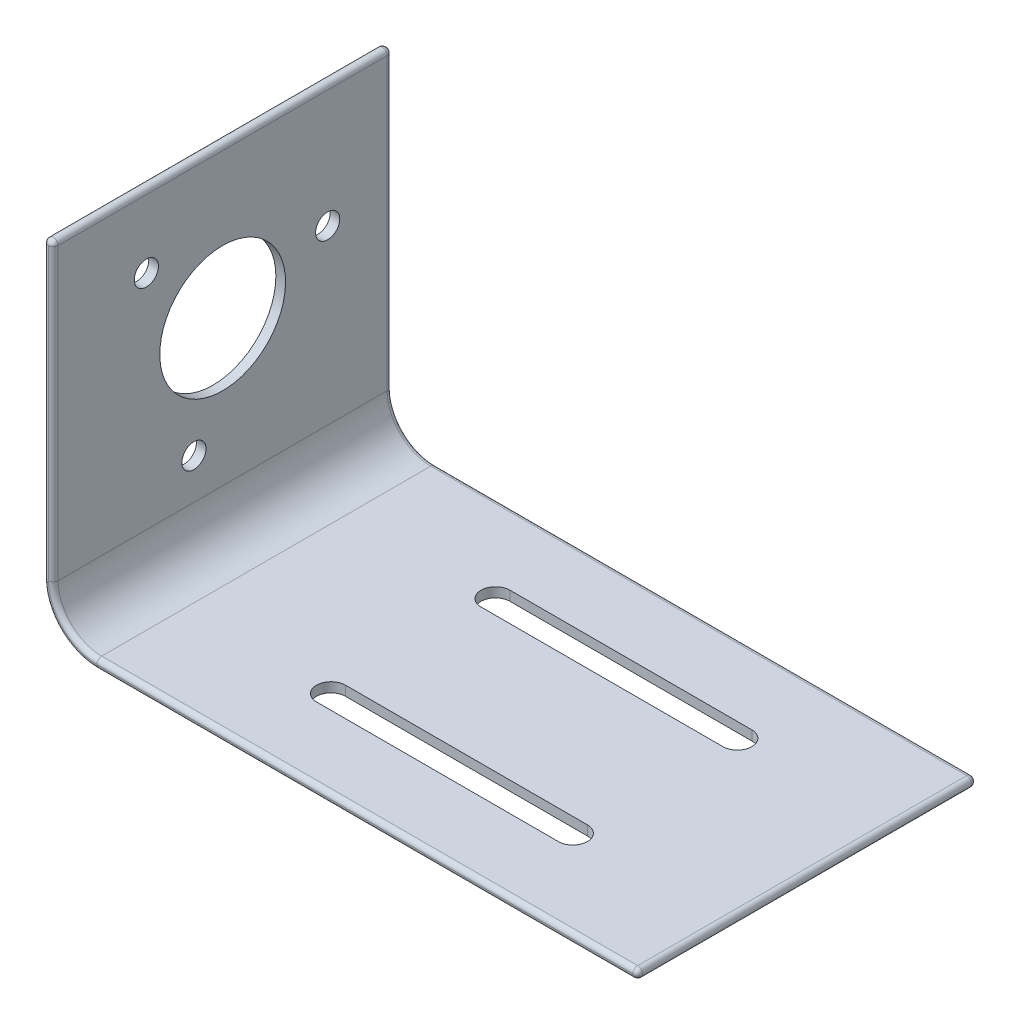
ISO-10303-21;
HEADER;
FILE_DESCRIPTION(('STEP AP214'),'2;1');
FILE_NAME('part.step','',(''),(''),'','','');
FILE_SCHEMA(('AUTOMOTIVE_DESIGN { 1 0 10303 214 1 1 1 1 }'));
ENDSEC;
DATA;
#1=APPLICATION_CONTEXT('core data for automotive mechanical design processes');
#2=APPLICATION_PROTOCOL_DEFINITION('international standard','automotive_design',2000,#1);
#3=PRODUCT_CONTEXT('',#1,'mechanical');
#4=PRODUCT('Part','Part','',(#3));
#5=PRODUCT_RELATED_PRODUCT_CATEGORY('part','',(#4));
#6=PRODUCT_DEFINITION_FORMATION('','',#4);
#7=PRODUCT_DEFINITION_CONTEXT('part definition',#1,'design');
#8=PRODUCT_DEFINITION('design','',#6,#7);
#9=PRODUCT_DEFINITION_SHAPE('','',#8);
#10=(LENGTH_UNIT() NAMED_UNIT(*) SI_UNIT(.MILLI.,.METRE.));
#11=(NAMED_UNIT(*) PLANE_ANGLE_UNIT() SI_UNIT($,.RADIAN.));
#12=(NAMED_UNIT(*) SI_UNIT($,.STERADIAN.) SOLID_ANGLE_UNIT());
#13=UNCERTAINTY_MEASURE_WITH_UNIT(LENGTH_MEASURE(1.E-05),#10,'distance_accuracy_value','');
#14=(GEOMETRIC_REPRESENTATION_CONTEXT(3) GLOBAL_UNCERTAINTY_ASSIGNED_CONTEXT((#13)) GLOBAL_UNIT_ASSIGNED_CONTEXT((#10,
#11,#12)) REPRESENTATION_CONTEXT('',''));
#15=CARTESIAN_POINT('',(0.,0.,0.));
#16=DIRECTION('',(0.,0.,1.));
#17=DIRECTION('',(1.,0.,0.));
#18=AXIS2_PLACEMENT_3D('',#15,#16,#17);
#19=CARTESIAN_POINT('',(0.,-0.5,35.));
#20=DIRECTION('',(0.,-1.,0.));
#21=DIRECTION('',(1.,0.,0.));
#22=AXIS2_PLACEMENT_3D('',#19,#20,#21);
#23=PLANE('',#22);
#24=CARTESIAN_POINT('',(-40.2,-0.500000000000007,9.00000000000001));
#25=DIRECTION('',(0.,-1.,0.));
#26=DIRECTION('',(1.,0.,0.));
#27=AXIS2_PLACEMENT_3D('',#24,#25,#26);
#28=CIRCLE('',#27,1.5);
#29=CARTESIAN_POINT('',(-40.2,-0.5,10.5));
#30=VERTEX_POINT('',#29);
#31=CARTESIAN_POINT('',(-40.2,-0.5,7.50000000000001));
#32=VERTEX_POINT('',#31);
#33=EDGE_CURVE('E242',#30,#32,#28,.T.);
#34=ORIENTED_EDGE('',*,*,#33,.F.);
#35=DIRECTION('',(-1.,0.,0.));
#36=VECTOR('',#35,1.);
#37=CARTESIAN_POINT('',(0.,-0.5,10.5));
#38=LINE('',#37,#36);
#39=CARTESIAN_POINT('',(-15.2,-0.500000000000002,10.5));
#40=VERTEX_POINT('',#39);
#41=EDGE_CURVE('E236',#40,#30,#38,.T.);
#42=ORIENTED_EDGE('',*,*,#41,.F.);
#43=CARTESIAN_POINT('',(-15.2,-0.5,9.));
#44=DIRECTION('',(0.,-1.,0.));
#45=DIRECTION('',(1.,0.,0.));
#46=AXIS2_PLACEMENT_3D('',#43,#44,#45);
#47=CIRCLE('',#46,1.5);
#48=CARTESIAN_POINT('',(-15.2,-0.5,7.5));
#49=VERTEX_POINT('',#48);
#50=EDGE_CURVE('E179',#49,#40,#47,.T.);
#51=ORIENTED_EDGE('',*,*,#50,.F.);
#52=DIRECTION('',(-1.,0.,0.));
#53=VECTOR('',#52,1.);
#54=CARTESIAN_POINT('',(0.,-0.5,7.5));
#55=LINE('',#54,#53);
#56=EDGE_CURVE('E239',#49,#32,#55,.T.);
#57=ORIENTED_EDGE('',*,*,#56,.T.);
#58=EDGE_LOOP('',(#34,#42,#51,#57));
#59=FACE_BOUND('',#58,.T.);
#60=DIRECTION('',(0.,0.,-1.));
#61=VECTOR('',#60,1.);
#62=CARTESIAN_POINT('',(-55.4,-0.500000000000006,35.));
#63=LINE('',#62,#61);
#64=CARTESIAN_POINT('',(-55.4,-0.500000000000006,34.5));
#65=VERTEX_POINT('',#64);
#66=CARTESIAN_POINT('',(-55.4,-0.500000000000006,0.5));
#67=VERTEX_POINT('',#66);
#68=EDGE_CURVE('E261',#65,#67,#63,.T.);
#69=ORIENTED_EDGE('',*,*,#68,.T.);
#70=DIRECTION('',(-1.,0.,0.));
#71=VECTOR('',#70,1.);
#72=CARTESIAN_POINT('',(0.,-0.5,0.5));
#73=LINE('',#72,#71);
#74=CARTESIAN_POINT('',(0.,-0.5,0.5));
#75=VERTEX_POINT('',#74);
#76=EDGE_CURVE('E295',#67,#75,#73,.F.);
#77=ORIENTED_EDGE('',*,*,#76,.T.);
#78=DIRECTION('',(0.,0.,-1.));
#79=VECTOR('',#78,1.);
#80=CARTESIAN_POINT('',(0.,-0.5,35.));
#81=LINE('',#80,#79);
#82=CARTESIAN_POINT('',(0.,-0.5,34.5));
#83=VERTEX_POINT('',#82);
#84=EDGE_CURVE('E258',#83,#75,#81,.T.);
#85=ORIENTED_EDGE('',*,*,#84,.F.);
#86=DIRECTION('',(-1.,0.,0.));
#87=VECTOR('',#86,1.);
#88=CARTESIAN_POINT('',(-55.4,-0.500000000000007,34.5));
#89=LINE('',#88,#87);
#90=EDGE_CURVE('E293',#83,#65,#89,.T.);
#91=ORIENTED_EDGE('',*,*,#90,.T.);
#92=EDGE_LOOP('',(#69,#77,#85,#91));
#93=FACE_BOUND('',#92,.T.);
#94=DIRECTION('',(-1.,0.,0.));
#95=VECTOR('',#94,1.);
#96=CARTESIAN_POINT('',(0.,-0.5,24.5));
#97=LINE('',#96,#95);
#98=CARTESIAN_POINT('',(-15.2,-0.5,24.5));
#99=VERTEX_POINT('',#98);
#100=CARTESIAN_POINT('',(-40.2,-0.5,24.5));
#101=VERTEX_POINT('',#100);
#102=EDGE_CURVE('E230',#99,#101,#97,.T.);
#103=ORIENTED_EDGE('',*,*,#102,.T.);
#104=CARTESIAN_POINT('',(-40.2,-0.500000000000007,26.));
#105=DIRECTION('',(0.,-1.,0.));
#106=DIRECTION('',(1.,0.,0.));
#107=AXIS2_PLACEMENT_3D('',#104,#105,#106);
#108=CIRCLE('',#107,1.5);
#109=CARTESIAN_POINT('',(-40.2,-0.5,27.5));
#110=VERTEX_POINT('',#109);
#111=EDGE_CURVE('E233',#101,#110,#108,.F.);
#112=ORIENTED_EDGE('',*,*,#111,.T.);
#113=DIRECTION('',(-1.,0.,0.));
#114=VECTOR('',#113,1.);
#115=CARTESIAN_POINT('',(0.,-0.5,27.5));
#116=LINE('',#115,#114);
#117=CARTESIAN_POINT('',(-15.2,-0.500000000000002,27.5));
#118=VERTEX_POINT('',#117);
#119=EDGE_CURVE('E203',#118,#110,#116,.T.);
#120=ORIENTED_EDGE('',*,*,#119,.F.);
#121=CARTESIAN_POINT('',(-15.2,-0.5,26.));
#122=DIRECTION('',(0.,-1.,0.));
#123=DIRECTION('',(1.,0.,0.));
#124=AXIS2_PLACEMENT_3D('',#121,#122,#123);
#125=CIRCLE('',#124,1.5);
#126=EDGE_CURVE('E227',#118,#99,#125,.F.);
#127=ORIENTED_EDGE('',*,*,#126,.T.);
#128=EDGE_LOOP('',(#103,#112,#120,#127));
#129=FACE_BOUND('',#128,.T.);
#130=ADVANCED_FACE('F36',(#59,#93,#129),#23,.T.);
#131=CARTESIAN_POINT('',(0.,0.5,35.));
#132=DIRECTION('',(0.,-1.,0.));
#133=DIRECTION('',(1.,0.,0.));
#134=AXIS2_PLACEMENT_3D('',#131,#132,#133);
#135=PLANE('',#134);
#136=DIRECTION('',(1.,0.,0.));
#137=VECTOR('',#136,1.);
#138=CARTESIAN_POINT('',(-40.2,0.499999999999995,10.5));
#139=LINE('',#138,#137);
#140=CARTESIAN_POINT('',(-40.2,0.499999999999995,10.5));
#141=VERTEX_POINT('',#140);
#142=CARTESIAN_POINT('',(-15.2,0.499999999999998,10.5));
#143=VERTEX_POINT('',#142);
#144=EDGE_CURVE('E186',#141,#143,#139,.T.);
#145=ORIENTED_EDGE('',*,*,#144,.F.);
#146=CARTESIAN_POINT('',(-40.2,0.499999999999995,9.00000000000001));
#147=DIRECTION('',(0.,1.,0.));
#148=DIRECTION('',(-1.,0.,0.));
#149=AXIS2_PLACEMENT_3D('',#146,#147,#148);
#150=CIRCLE('',#149,1.5);
#151=CARTESIAN_POINT('',(-40.2,0.499999999999995,7.50000000000001));
#152=VERTEX_POINT('',#151);
#153=EDGE_CURVE('E191',#152,#141,#150,.T.);
#154=ORIENTED_EDGE('',*,*,#153,.F.);
#155=DIRECTION('',(1.,0.,0.));
#156=VECTOR('',#155,1.);
#157=CARTESIAN_POINT('',(-40.2,0.499999999999995,7.50000000000001));
#158=LINE('',#157,#156);
#159=CARTESIAN_POINT('',(-15.2,0.499999999999998,7.5));
#160=VERTEX_POINT('',#159);
#161=EDGE_CURVE('E196',#152,#160,#158,.T.);
#162=ORIENTED_EDGE('',*,*,#161,.T.);
#163=CARTESIAN_POINT('',(-15.2,0.499999999999998,9.));
#164=DIRECTION('',(0.,1.,0.));
#165=DIRECTION('',(-1.,0.,0.));
#166=AXIS2_PLACEMENT_3D('',#163,#164,#165);
#167=CIRCLE('',#166,1.5);
#168=EDGE_CURVE('E176',#143,#160,#167,.T.);
#169=ORIENTED_EDGE('',*,*,#168,.F.);
#170=EDGE_LOOP('',(#145,#154,#162,#169));
#171=FACE_BOUND('',#170,.T.);
#172=DIRECTION('',(0.,0.,-1.));
#173=VECTOR('',#172,1.);
#174=CARTESIAN_POINT('',(0.,0.5,35.));
#175=LINE('',#174,#173);
#176=CARTESIAN_POINT('',(0.,0.5,34.5));
#177=VERTEX_POINT('',#176);
#178=CARTESIAN_POINT('',(0.,0.5,0.5));
#179=VERTEX_POINT('',#178);
#180=EDGE_CURVE('E255',#177,#179,#175,.T.);
#181=ORIENTED_EDGE('',*,*,#180,.T.);
#182=DIRECTION('',(-1.,0.,0.));
#183=VECTOR('',#182,1.);
#184=CARTESIAN_POINT('',(-55.4,0.499999999999993,0.5));
#185=LINE('',#184,#183);
#186=CARTESIAN_POINT('',(-55.4,0.499999999999993,0.5));
#187=VERTEX_POINT('',#186);
#188=EDGE_CURVE('E300',#179,#187,#185,.T.);
#189=ORIENTED_EDGE('',*,*,#188,.T.);
#190=DIRECTION('',(0.,0.,-1.));
#191=VECTOR('',#190,1.);
#192=CARTESIAN_POINT('',(-55.4,0.499999999999993,35.));
#193=LINE('',#192,#191);
#194=CARTESIAN_POINT('',(-55.4,0.499999999999993,34.5));
#195=VERTEX_POINT('',#194);
#196=EDGE_CURVE('E248',#195,#187,#193,.T.);
#197=ORIENTED_EDGE('',*,*,#196,.F.);
#198=DIRECTION('',(-1.,0.,0.));
#199=VECTOR('',#198,1.);
#200=CARTESIAN_POINT('',(0.,0.5,34.5));
#201=LINE('',#200,#199);
#202=EDGE_CURVE('E297',#195,#177,#201,.F.);
#203=ORIENTED_EDGE('',*,*,#202,.T.);
#204=EDGE_LOOP('',(#181,#189,#197,#203));
#205=FACE_BOUND('',#204,.T.);
#206=CARTESIAN_POINT('',(-40.2,0.499999999999995,26.));
#207=DIRECTION('',(0.,-1.,0.));
#208=DIRECTION('',(1.,0.,0.));
#209=AXIS2_PLACEMENT_3D('',#206,#207,#208);
#210=CIRCLE('',#209,1.5);
#211=CARTESIAN_POINT('',(-40.2,0.499999999999995,27.5));
#212=VERTEX_POINT('',#211);
#213=CARTESIAN_POINT('',(-40.2,0.499999999999995,24.5));
#214=VERTEX_POINT('',#213);
#215=EDGE_CURVE('E223',#212,#214,#210,.T.);
#216=ORIENTED_EDGE('',*,*,#215,.T.);
#217=DIRECTION('',(1.,0.,0.));
#218=VECTOR('',#217,1.);
#219=CARTESIAN_POINT('',(-40.2,0.499999999999995,24.5));
#220=LINE('',#219,#218);
#221=CARTESIAN_POINT('',(-15.2,0.499999999999998,24.5));
#222=VERTEX_POINT('',#221);
#223=EDGE_CURVE('E220',#214,#222,#220,.T.);
#224=ORIENTED_EDGE('',*,*,#223,.T.);
#225=CARTESIAN_POINT('',(-15.2,0.499999999999998,26.));
#226=DIRECTION('',(0.,-1.,0.));
#227=DIRECTION('',(1.,0.,0.));
#228=AXIS2_PLACEMENT_3D('',#225,#226,#227);
#229=CIRCLE('',#228,1.5);
#230=CARTESIAN_POINT('',(-15.2,0.499999999999998,27.5));
#231=VERTEX_POINT('',#230);
#232=EDGE_CURVE('E217',#222,#231,#229,.T.);
#233=ORIENTED_EDGE('',*,*,#232,.T.);
#234=DIRECTION('',(1.,0.,0.));
#235=VECTOR('',#234,1.);
#236=CARTESIAN_POINT('',(-40.2,0.499999999999995,27.5));
#237=LINE('',#236,#235);
#238=EDGE_CURVE('E215',#212,#231,#237,.T.);
#239=ORIENTED_EDGE('',*,*,#238,.F.);
#240=EDGE_LOOP('',(#216,#224,#233,#239));
#241=FACE_BOUND('',#240,.T.);
#242=ADVANCED_FACE('F193',(#171,#205,#241),#135,.F.);
#243=CARTESIAN_POINT('',(-55.4,4.99999999999999,35.));
#244=DIRECTION('',(0.,0.,-1.));
#245=DIRECTION('',(-1.,0.,0.));
#246=AXIS2_PLACEMENT_3D('',#243,#244,#245);
#247=CYLINDRICAL_SURFACE('',#246,4.5);
#248=ORIENTED_EDGE('',*,*,#196,.T.);
#249=CARTESIAN_POINT('',(-55.4,4.99999999999999,0.5));
#250=DIRECTION('',(0.,0.,-1.));
#251=DIRECTION('',(-1.,0.,0.));
#252=AXIS2_PLACEMENT_3D('',#249,#250,#251);
#253=CIRCLE('',#252,4.5);
#254=CARTESIAN_POINT('',(-59.9,4.99999999999999,0.5));
#255=VERTEX_POINT('',#254);
#256=EDGE_CURVE('E304',#187,#255,#253,.T.);
#257=ORIENTED_EDGE('',*,*,#256,.T.);
#258=DIRECTION('',(0.,0.,-1.));
#259=VECTOR('',#258,1.);
#260=CARTESIAN_POINT('',(-59.9,4.99999999999999,35.));
#261=LINE('',#260,#259);
#262=CARTESIAN_POINT('',(-59.9,4.99999999999999,34.5));
#263=VERTEX_POINT('',#262);
#264=EDGE_CURVE('E273',#263,#255,#261,.T.);
#265=ORIENTED_EDGE('',*,*,#264,.F.);
#266=CARTESIAN_POINT('',(-55.4,4.99999999999999,34.5));
#267=DIRECTION('',(0.,0.,-1.));
#268=DIRECTION('',(-1.,0.,0.));
#269=AXIS2_PLACEMENT_3D('',#266,#267,#268);
#270=CIRCLE('',#269,4.5);
#271=EDGE_CURVE('E302',#263,#195,#270,.F.);
#272=ORIENTED_EDGE('',*,*,#271,.T.);
#273=EDGE_LOOP('',(#248,#257,#265,#272));
#274=FACE_BOUND('',#273,.T.);
#275=ADVANCED_FACE('F384',(#274),#247,.F.);
#276=CARTESIAN_POINT('',(-59.9,4.99999999999999,35.));
#277=DIRECTION('',(-1.,0.,0.));
#278=DIRECTION('',(0.,-1.,0.));
#279=AXIS2_PLACEMENT_3D('',#276,#277,#278);
#280=PLANE('',#279);
#281=CARTESIAN_POINT('',(-59.9,27.9813748364237,25.3858135737857));
#282=DIRECTION('',(1.,0.,0.));
#283=DIRECTION('',(0.,0.,-1.));
#284=AXIS2_PLACEMENT_3D('',#281,#282,#283);
#285=CIRCLE('',#284,1.24999999999999);
#286=CARTESIAN_POINT('',(-59.9,27.9813748364237,24.1358135737857));
#287=VERTEX_POINT('',#286);
#288=EDGE_CURVE('E721',#287,#287,#285,.T.);
#289=ORIENTED_EDGE('',*,*,#288,.F.);
#290=EDGE_LOOP('',(#289));
#291=FACE_BOUND('',#290,.T.);
#292=CARTESIAN_POINT('',(-59.9,9.17999769738173,20.4691665785755));
#293=DIRECTION('',(1.,0.,0.));
#294=DIRECTION('',(0.,0.,-1.));
#295=AXIS2_PLACEMENT_3D('',#292,#293,#294);
#296=CIRCLE('',#295,1.24999999999999);
#297=CARTESIAN_POINT('',(-59.9,9.17999769738173,19.2191665785755));
#298=VERTEX_POINT('',#297);
#299=EDGE_CURVE('E723',#298,#298,#296,.T.);
#300=ORIENTED_EDGE('',*,*,#299,.F.);
#301=EDGE_LOOP('',(#300));
#302=FACE_BOUND('',#301,.T.);
#303=CARTESIAN_POINT('',(-59.9,22.8386274661952,6.64501984763821));
#304=DIRECTION('',(1.,0.,0.));
#305=DIRECTION('',(0.,0.,-1.));
#306=AXIS2_PLACEMENT_3D('',#303,#304,#305);
#307=CIRCLE('',#306,1.24999999999999);
#308=CARTESIAN_POINT('',(-59.9,22.8386274661952,5.39501984763822));
#309=VERTEX_POINT('',#308);
#310=EDGE_CURVE('E731',#309,#309,#307,.T.);
#311=ORIENTED_EDGE('',*,*,#310,.F.);
#312=EDGE_LOOP('',(#311));
#313=FACE_BOUND('',#312,.T.);
#314=CARTESIAN_POINT('',(-59.9,20.,17.5));
#315=DIRECTION('',(1.,0.,0.));
#316=DIRECTION('',(0.,1.,0.));
#317=AXIS2_PLACEMENT_3D('',#314,#315,#316);
#318=CIRCLE('',#317,6.5);
#319=CARTESIAN_POINT('',(-59.9,26.5,17.5));
#320=VERTEX_POINT('',#319);
#321=EDGE_CURVE('E245',#320,#320,#318,.T.);
#322=ORIENTED_EDGE('',*,*,#321,.F.);
#323=EDGE_LOOP('',(#322));
#324=FACE_BOUND('',#323,.T.);
#325=ORIENTED_EDGE('',*,*,#264,.T.);
#326=DIRECTION('',(0.,1.,0.));
#327=VECTOR('',#326,1.);
#328=CARTESIAN_POINT('',(-59.9,35.,0.5));
#329=LINE('',#328,#327);
#330=CARTESIAN_POINT('',(-59.9,35.,0.5));
#331=VERTEX_POINT('',#330);
#332=EDGE_CURVE('E278',#255,#331,#329,.T.);
#333=ORIENTED_EDGE('',*,*,#332,.T.);
#334=DIRECTION('',(0.,0.,-1.));
#335=VECTOR('',#334,1.);
#336=CARTESIAN_POINT('',(-59.9,35.,35.));
#337=LINE('',#336,#335);
#338=CARTESIAN_POINT('',(-59.9,35.,34.5));
#339=VERTEX_POINT('',#338);
#340=EDGE_CURVE('E270',#339,#331,#337,.T.);
#341=ORIENTED_EDGE('',*,*,#340,.F.);
#342=DIRECTION('',(0.,1.,0.));
#343=VECTOR('',#342,1.);
#344=CARTESIAN_POINT('',(-59.9,4.99999999999999,34.5));
#345=LINE('',#344,#343);
#346=EDGE_CURVE('E276',#339,#263,#345,.F.);
#347=ORIENTED_EDGE('',*,*,#346,.T.);
#348=EDGE_LOOP('',(#325,#333,#341,#347));
#349=FACE_BOUND('',#348,.T.);
#350=ADVANCED_FACE('F381',(#291,#302,#313,#324,#349),#280,.F.);
#351=CARTESIAN_POINT('',(-60.4,35.,35.));
#352=DIRECTION('',(0.,0.,-1.));
#353=DIRECTION('',(-1.,0.,0.));
#354=AXIS2_PLACEMENT_3D('',#351,#352,#353);
#355=CYLINDRICAL_SURFACE('',#354,0.5);
#356=ORIENTED_EDGE('',*,*,#340,.T.);
#357=CARTESIAN_POINT('',(-60.4,35.,0.5));
#358=DIRECTION('',(0.,0.,-1.));
#359=DIRECTION('',(-1.,0.,0.));
#360=AXIS2_PLACEMENT_3D('',#357,#358,#359);
#361=CIRCLE('',#360,0.5);
#362=CARTESIAN_POINT('',(-60.9,35.,0.5));
#363=VERTEX_POINT('',#362);
#364=EDGE_CURVE('E283',#331,#363,#361,.F.);
#365=ORIENTED_EDGE('',*,*,#364,.T.);
#366=DIRECTION('',(0.,0.,-1.));
#367=VECTOR('',#366,1.);
#368=CARTESIAN_POINT('',(-60.9,35.,35.));
#369=LINE('',#368,#367);
#370=CARTESIAN_POINT('',(-60.9,35.,34.5));
#371=VERTEX_POINT('',#370);
#372=EDGE_CURVE('E267',#371,#363,#369,.T.);
#373=ORIENTED_EDGE('',*,*,#372,.F.);
#374=CARTESIAN_POINT('',(-60.4,35.,34.5));
#375=DIRECTION('',(0.,0.,-1.));
#376=DIRECTION('',(-1.,0.,0.));
#377=AXIS2_PLACEMENT_3D('',#374,#375,#376);
#378=CIRCLE('',#377,0.5);
#379=EDGE_CURVE('E281',#371,#339,#378,.T.);
#380=ORIENTED_EDGE('',*,*,#379,.T.);
#381=EDGE_LOOP('',(#356,#365,#373,#380));
#382=FACE_BOUND('',#381,.T.);
#383=ADVANCED_FACE('F398',(#382),#355,.T.);
#384=CARTESIAN_POINT('',(-60.9,4.99999999999999,35.));
#385=DIRECTION('',(-1.,0.,0.));
#386=DIRECTION('',(0.,-1.,0.));
#387=AXIS2_PLACEMENT_3D('',#384,#385,#386);
#388=PLANE('',#387);
#389=CARTESIAN_POINT('',(-60.9,27.9813748364237,25.3858135737857));
#390=DIRECTION('',(1.,0.,0.));
#391=DIRECTION('',(0.,0.,-1.));
#392=AXIS2_PLACEMENT_3D('',#389,#390,#391);
#393=CIRCLE('',#392,1.24999999999999);
#394=CARTESIAN_POINT('',(-60.9,27.9813748364237,24.1358135737857));
#395=VERTEX_POINT('',#394);
#396=EDGE_CURVE('E718',#395,#395,#393,.T.);
#397=ORIENTED_EDGE('',*,*,#396,.T.);
#398=EDGE_LOOP('',(#397));
#399=FACE_BOUND('',#398,.T.);
#400=CARTESIAN_POINT('',(-60.9,9.17999769738173,20.4691665785755));
#401=DIRECTION('',(1.,0.,0.));
#402=DIRECTION('',(0.,0.,-1.));
#403=AXIS2_PLACEMENT_3D('',#400,#401,#402);
#404=CIRCLE('',#403,1.24999999999999);
#405=CARTESIAN_POINT('',(-60.9,9.17999769738173,19.2191665785755));
#406=VERTEX_POINT('',#405);
#407=EDGE_CURVE('E728',#406,#406,#404,.T.);
#408=ORIENTED_EDGE('',*,*,#407,.T.);
#409=EDGE_LOOP('',(#408));
#410=FACE_BOUND('',#409,.T.);
#411=CARTESIAN_POINT('',(-60.9,22.8386274661952,6.64501984763821));
#412=DIRECTION('',(1.,0.,0.));
#413=DIRECTION('',(0.,0.,-1.));
#414=AXIS2_PLACEMENT_3D('',#411,#412,#413);
#415=CIRCLE('',#414,1.24999999999999);
#416=CARTESIAN_POINT('',(-60.9,22.8386274661952,5.39501984763822));
#417=VERTEX_POINT('',#416);
#418=EDGE_CURVE('E209',#417,#417,#415,.T.);
#419=ORIENTED_EDGE('',*,*,#418,.T.);
#420=EDGE_LOOP('',(#419));
#421=FACE_BOUND('',#420,.T.);
#422=CARTESIAN_POINT('',(-60.9,20.,17.5));
#423=DIRECTION('',(-1.,0.,0.));
#424=DIRECTION('',(0.,-1.,0.));
#425=AXIS2_PLACEMENT_3D('',#422,#423,#424);
#426=CIRCLE('',#425,6.5);
#427=CARTESIAN_POINT('',(-60.9,13.5,17.5));
#428=VERTEX_POINT('',#427);
#429=EDGE_CURVE('E249',#428,#428,#426,.F.);
#430=ORIENTED_EDGE('',*,*,#429,.T.);
#431=EDGE_LOOP('',(#430));
#432=FACE_BOUND('',#431,.T.);
#433=ORIENTED_EDGE('',*,*,#372,.T.);
#434=DIRECTION('',(0.,1.,0.));
#435=VECTOR('',#434,1.);
#436=CARTESIAN_POINT('',(-60.9,4.99999999999999,0.5));
#437=LINE('',#436,#435);
#438=CARTESIAN_POINT('',(-60.9,4.99999999999999,0.5));
#439=VERTEX_POINT('',#438);
#440=EDGE_CURVE('E287',#363,#439,#437,.F.);
#441=ORIENTED_EDGE('',*,*,#440,.T.);
#442=DIRECTION('',(0.,0.,-1.));
#443=VECTOR('',#442,1.);
#444=CARTESIAN_POINT('',(-60.9,4.99999999999999,35.));
#445=LINE('',#444,#443);
#446=CARTESIAN_POINT('',(-60.9,4.99999999999999,34.5));
#447=VERTEX_POINT('',#446);
#448=EDGE_CURVE('E264',#447,#439,#445,.T.);
#449=ORIENTED_EDGE('',*,*,#448,.F.);
#450=DIRECTION('',(0.,1.,0.));
#451=VECTOR('',#450,1.);
#452=CARTESIAN_POINT('',(-60.9,35.,34.5));
#453=LINE('',#452,#451);
#454=EDGE_CURVE('E285',#447,#371,#453,.T.);
#455=ORIENTED_EDGE('',*,*,#454,.T.);
#456=EDGE_LOOP('',(#433,#441,#449,#455));
#457=FACE_BOUND('',#456,.T.);
#458=ADVANCED_FACE('F402',(#399,#410,#421,#432,#457),#388,.T.);
#459=CARTESIAN_POINT('',(-55.4,4.99999999999999,35.));
#460=DIRECTION('',(0.,0.,-1.));
#461=DIRECTION('',(-1.,0.,0.));
#462=AXIS2_PLACEMENT_3D('',#459,#460,#461);
#463=CYLINDRICAL_SURFACE('',#462,5.5);
#464=ORIENTED_EDGE('',*,*,#448,.T.);
#465=CARTESIAN_POINT('',(-55.4,4.99999999999999,0.5));
#466=DIRECTION('',(0.,0.,-1.));
#467=DIRECTION('',(-1.,0.,0.));
#468=AXIS2_PLACEMENT_3D('',#465,#466,#467);
#469=CIRCLE('',#468,5.5);
#470=EDGE_CURVE('E291',#439,#67,#469,.F.);
#471=ORIENTED_EDGE('',*,*,#470,.T.);
#472=ORIENTED_EDGE('',*,*,#68,.F.);
#473=CARTESIAN_POINT('',(-55.4,4.99999999999999,34.5));
#474=DIRECTION('',(0.,0.,-1.));
#475=DIRECTION('',(-1.,0.,0.));
#476=AXIS2_PLACEMENT_3D('',#473,#474,#475);
#477=CIRCLE('',#476,5.5);
#478=EDGE_CURVE('E289',#65,#447,#477,.T.);
#479=ORIENTED_EDGE('',*,*,#478,.T.);
#480=EDGE_LOOP('',(#464,#471,#472,#479));
#481=FACE_BOUND('',#480,.T.);
#482=ADVANCED_FACE('F428',(#481),#463,.T.);
#483=CARTESIAN_POINT('',(0.,0.,35.));
#484=DIRECTION('',(0.,0.,-1.));
#485=DIRECTION('',(-1.,0.,0.));
#486=AXIS2_PLACEMENT_3D('',#483,#484,#485);
#487=CYLINDRICAL_SURFACE('',#486,0.5);
#488=ORIENTED_EDGE('',*,*,#84,.T.);
#489=CARTESIAN_POINT('',(0.,0.,0.5));
#490=DIRECTION('',(0.,0.,-1.));
#491=DIRECTION('',(-1.,0.,0.));
#492=AXIS2_PLACEMENT_3D('',#489,#490,#491);
#493=CIRCLE('',#492,0.5);
#494=EDGE_CURVE('E11',#75,#179,#493,.F.);
#495=ORIENTED_EDGE('',*,*,#494,.T.);
#496=ORIENTED_EDGE('',*,*,#180,.F.);
#497=CARTESIAN_POINT('',(0.,0.,34.5));
#498=DIRECTION('',(0.,0.,-1.));
#499=DIRECTION('',(-1.,0.,0.));
#500=AXIS2_PLACEMENT_3D('',#497,#498,#499);
#501=CIRCLE('',#500,0.5);
#502=EDGE_CURVE('E45',#177,#83,#501,.T.);
#503=ORIENTED_EDGE('',*,*,#502,.T.);
#504=EDGE_LOOP('',(#488,#495,#496,#503));
#505=FACE_BOUND('',#504,.T.);
#506=ADVANCED_FACE('F427',(#505),#487,.T.);
#507=CARTESIAN_POINT('',(-60.902,20.,17.5));
#508=DIRECTION('',(1.,0.,0.));
#509=DIRECTION('',(0.,1.,0.));
#510=AXIS2_PLACEMENT_3D('',#507,#508,#509);
#511=CYLINDRICAL_SURFACE('',#510,6.5);
#512=ORIENTED_EDGE('',*,*,#321,.T.);
#513=EDGE_LOOP('',(#512));
#514=FACE_BOUND('',#513,.T.);
#515=ORIENTED_EDGE('',*,*,#429,.F.);
#516=EDGE_LOOP('',(#515));
#517=FACE_BOUND('',#516,.T.);
#518=ADVANCED_FACE('F470',(#514,#517),#511,.F.);
#519=CARTESIAN_POINT('',(-55.4,0.,0.5));
#520=DIRECTION('',(-1.,0.,0.));
#521=DIRECTION('',(0.,-1.,0.));
#522=AXIS2_PLACEMENT_3D('',#519,#520,#521);
#523=CYLINDRICAL_SURFACE('',#522,0.5);
#524=CARTESIAN_POINT('',(0.,0.,0.5));
#525=DIRECTION('',(1.,0.,0.));
#526=DIRECTION('',(0.,1.,0.));
#527=AXIS2_PLACEMENT_3D('',#524,#525,#526);
#528=CIRCLE('',#527,0.5);
#529=CARTESIAN_POINT('',(0.,0.,0.));
#530=VERTEX_POINT('',#529);
#531=EDGE_CURVE('E252',#75,#530,#528,.T.);
#532=ORIENTED_EDGE('',*,*,#531,.F.);
#533=ORIENTED_EDGE('',*,*,#76,.F.);
#534=CARTESIAN_POINT('',(-55.4,0.,0.5));
#535=DIRECTION('',(-1.,0.,0.));
#536=DIRECTION('',(0.,0.,1.));
#537=AXIS2_PLACEMENT_3D('',#534,#535,#536);
#538=CIRCLE('',#537,0.5);
#539=CARTESIAN_POINT('',(-55.4,0.,0.));
#540=VERTEX_POINT('',#539);
#541=EDGE_CURVE('E333',#540,#67,#538,.T.);
#542=ORIENTED_EDGE('',*,*,#541,.F.);
#543=DIRECTION('',(-1.,0.,0.));
#544=VECTOR('',#543,1.);
#545=CARTESIAN_POINT('',(-55.4,0.,0.));
#546=LINE('',#545,#544);
#547=EDGE_CURVE('E330',#530,#540,#546,.T.);
#548=ORIENTED_EDGE('',*,*,#547,.F.);
#549=EDGE_LOOP('',(#532,#533,#542,#548));
#550=FACE_BOUND('',#549,.T.);
#551=ADVANCED_FACE('F477',(#550),#523,.T.);
#552=CARTESIAN_POINT('',(0.,0.,0.5));
#553=DIRECTION('',(0.,0.,-1.));
#554=DIRECTION('',(-1.,0.,0.));
#555=AXIS2_PLACEMENT_3D('',#552,#553,#554);
#556=SPHERICAL_SURFACE('',#555,0.5);
#557=ORIENTED_EDGE('',*,*,#494,.F.);
#558=ORIENTED_EDGE('',*,*,#531,.T.);
#559=CARTESIAN_POINT('',(0.,0.,0.5));
#560=DIRECTION('',(-1.,0.,0.));
#561=DIRECTION('',(0.,-1.,0.));
#562=AXIS2_PLACEMENT_3D('',#559,#560,#561);
#563=CIRCLE('',#562,0.5);
#564=EDGE_CURVE('E327',#179,#530,#563,.T.);
#565=ORIENTED_EDGE('',*,*,#564,.F.);
#566=EDGE_LOOP('',(#557,#558,#565));
#567=FACE_BOUND('',#566,.T.);
#568=ADVANCED_FACE('F484',(#567),#556,.T.);
#569=CARTESIAN_POINT('',(-55.4,4.99999999999999,0.5));
#570=DIRECTION('',(0.,0.,-1.));
#571=DIRECTION('',(-1.,0.,0.));
#572=AXIS2_PLACEMENT_3D('',#569,#570,#571);
#573=TOROIDAL_SURFACE('',#572,5.,0.5);
#574=ORIENTED_EDGE('',*,*,#541,.T.);
#575=ORIENTED_EDGE('',*,*,#470,.F.);
#576=CARTESIAN_POINT('',(-60.4,4.99999999999999,0.5));
#577=DIRECTION('',(0.,1.,0.));
#578=DIRECTION('',(-1.,0.,0.));
#579=AXIS2_PLACEMENT_3D('',#576,#577,#578);
#580=CIRCLE('',#579,0.5);
#581=CARTESIAN_POINT('',(-60.4,4.99999999999999,0.));
#582=VERTEX_POINT('',#581);
#583=EDGE_CURVE('E324',#582,#439,#580,.T.);
#584=ORIENTED_EDGE('',*,*,#583,.F.);
#585=CARTESIAN_POINT('',(-55.4,4.99999999999999,0.));
#586=DIRECTION('',(0.,0.,-1.));
#587=DIRECTION('',(-1.,0.,0.));
#588=AXIS2_PLACEMENT_3D('',#585,#586,#587);
#589=CIRCLE('',#588,5.);
#590=EDGE_CURVE('E321',#540,#582,#589,.T.);
#591=ORIENTED_EDGE('',*,*,#590,.F.);
#592=EDGE_LOOP('',(#574,#575,#584,#591));
#593=FACE_BOUND('',#592,.T.);
#594=ADVANCED_FACE('F492',(#593),#573,.T.);
#595=CARTESIAN_POINT('',(0.,0.,0.5));
#596=DIRECTION('',(1.,0.,0.));
#597=DIRECTION('',(0.,1.,0.));
#598=AXIS2_PLACEMENT_3D('',#595,#596,#597);
#599=CYLINDRICAL_SURFACE('',#598,0.5);
#600=ORIENTED_EDGE('',*,*,#564,.T.);
#601=ORIENTED_EDGE('',*,*,#547,.T.);
#602=CARTESIAN_POINT('',(-55.4,0.,0.5));
#603=DIRECTION('',(-1.,0.,0.));
#604=DIRECTION('',(0.,0.,1.));
#605=AXIS2_PLACEMENT_3D('',#602,#603,#604);
#606=CIRCLE('',#605,0.5);
#607=EDGE_CURVE('E318',#187,#540,#606,.T.);
#608=ORIENTED_EDGE('',*,*,#607,.F.);
#609=ORIENTED_EDGE('',*,*,#188,.F.);
#610=EDGE_LOOP('',(#600,#601,#608,#609));
#611=FACE_BOUND('',#610,.T.);
#612=ADVANCED_FACE('F500',(#611),#599,.T.);
#613=CARTESIAN_POINT('',(-60.4,5.,0.5));
#614=DIRECTION('',(0.,1.,0.));
#615=DIRECTION('',(-1.,0.,0.));
#616=AXIS2_PLACEMENT_3D('',#613,#614,#615);
#617=CYLINDRICAL_SURFACE('',#616,0.5);
#618=ORIENTED_EDGE('',*,*,#583,.T.);
#619=ORIENTED_EDGE('',*,*,#440,.F.);
#620=CARTESIAN_POINT('',(-60.4,35.,0.5));
#621=DIRECTION('',(0.,1.,0.));
#622=DIRECTION('',(0.,0.,1.));
#623=AXIS2_PLACEMENT_3D('',#620,#621,#622);
#624=CIRCLE('',#623,0.5);
#625=CARTESIAN_POINT('',(-60.4,35.,0.));
#626=VERTEX_POINT('',#625);
#627=EDGE_CURVE('E315',#626,#363,#624,.T.);
#628=ORIENTED_EDGE('',*,*,#627,.F.);
#629=DIRECTION('',(0.,1.,0.));
#630=VECTOR('',#629,1.);
#631=CARTESIAN_POINT('',(-60.4,5.,0.));
#632=LINE('',#631,#630);
#633=EDGE_CURVE('E312',#582,#626,#632,.T.);
#634=ORIENTED_EDGE('',*,*,#633,.F.);
#635=EDGE_LOOP('',(#618,#619,#628,#634));
#636=FACE_BOUND('',#635,.T.);
#637=ADVANCED_FACE('F405',(#636),#617,.T.);
#638=CARTESIAN_POINT('',(-55.4,4.99999999999999,0.5));
#639=DIRECTION('',(0.,0.,-1.));
#640=DIRECTION('',(-1.,0.,0.));
#641=AXIS2_PLACEMENT_3D('',#638,#639,#640);
#642=TOROIDAL_SURFACE('',#641,5.,0.5);
#643=ORIENTED_EDGE('',*,*,#607,.T.);
#644=ORIENTED_EDGE('',*,*,#590,.T.);
#645=CARTESIAN_POINT('',(-60.4,4.99999999999999,0.5));
#646=DIRECTION('',(0.,1.,0.));
#647=DIRECTION('',(0.,0.,1.));
#648=AXIS2_PLACEMENT_3D('',#645,#646,#647);
#649=CIRCLE('',#648,0.5);
#650=EDGE_CURVE('E309',#255,#582,#649,.T.);
#651=ORIENTED_EDGE('',*,*,#650,.F.);
#652=ORIENTED_EDGE('',*,*,#256,.F.);
#653=EDGE_LOOP('',(#643,#644,#651,#652));
#654=FACE_BOUND('',#653,.T.);
#655=ADVANCED_FACE('F389',(#654),#642,.T.);
#656=CARTESIAN_POINT('',(-60.4,35.,0.5));
#657=DIRECTION('',(0.,0.,-1.));
#658=DIRECTION('',(-1.,0.,0.));
#659=AXIS2_PLACEMENT_3D('',#656,#657,#658);
#660=SPHERICAL_SURFACE('',#659,0.5);
#661=ORIENTED_EDGE('',*,*,#627,.T.);
#662=ORIENTED_EDGE('',*,*,#364,.F.);
#663=CARTESIAN_POINT('',(-60.4,35.,0.5));
#664=DIRECTION('',(0.,-1.,0.));
#665=DIRECTION('',(0.,0.,-1.));
#666=AXIS2_PLACEMENT_3D('',#663,#664,#665);
#667=CIRCLE('',#666,0.5);
#668=EDGE_CURVE('E307',#626,#331,#667,.T.);
#669=ORIENTED_EDGE('',*,*,#668,.F.);
#670=EDGE_LOOP('',(#661,#662,#669));
#671=FACE_BOUND('',#670,.T.);
#672=ADVANCED_FACE('F407',(#671),#660,.T.);
#673=CARTESIAN_POINT('',(-60.4,4.99999999999999,0.5));
#674=DIRECTION('',(0.,-1.,0.));
#675=DIRECTION('',(1.,0.,0.));
#676=AXIS2_PLACEMENT_3D('',#673,#674,#675);
#677=CYLINDRICAL_SURFACE('',#676,0.5);
#678=ORIENTED_EDGE('',*,*,#650,.T.);
#679=ORIENTED_EDGE('',*,*,#633,.T.);
#680=ORIENTED_EDGE('',*,*,#668,.T.);
#681=ORIENTED_EDGE('',*,*,#332,.F.);
#682=EDGE_LOOP('',(#678,#679,#680,#681));
#683=FACE_BOUND('',#682,.T.);
#684=ADVANCED_FACE('F394',(#683),#677,.T.);
#685=CARTESIAN_POINT('',(-60.4,4.99999999999999,34.5));
#686=DIRECTION('',(0.,-1.,0.));
#687=DIRECTION('',(1.,0.,0.));
#688=AXIS2_PLACEMENT_3D('',#685,#686,#687);
#689=CYLINDRICAL_SURFACE('',#688,0.5);
#690=CARTESIAN_POINT('',(-60.4,35.,34.5));
#691=DIRECTION('',(0.,1.,0.));
#692=DIRECTION('',(0.,0.,1.));
#693=AXIS2_PLACEMENT_3D('',#690,#691,#692);
#694=CIRCLE('',#693,0.5);
#695=CARTESIAN_POINT('',(-60.4,35.,35.));
#696=VERTEX_POINT('',#695);
#697=EDGE_CURVE('E40',#371,#696,#694,.T.);
#698=ORIENTED_EDGE('',*,*,#697,.F.);
#699=ORIENTED_EDGE('',*,*,#454,.F.);
#700=CARTESIAN_POINT('',(-60.4,4.99999999999999,34.5));
#701=DIRECTION('',(0.,-1.,0.));
#702=DIRECTION('',(0.,0.,-1.));
#703=AXIS2_PLACEMENT_3D('',#700,#701,#702);
#704=CIRCLE('',#703,0.5);
#705=CARTESIAN_POINT('',(-60.4,4.99999999999999,35.));
#706=VERTEX_POINT('',#705);
#707=EDGE_CURVE('E360',#706,#447,#704,.T.);
#708=ORIENTED_EDGE('',*,*,#707,.F.);
#709=DIRECTION('',(0.,1.,0.));
#710=VECTOR('',#709,1.);
#711=CARTESIAN_POINT('',(-60.4,4.99999999999999,35.));
#712=LINE('',#711,#710);
#713=EDGE_CURVE('E358',#696,#706,#712,.F.);
#714=ORIENTED_EDGE('',*,*,#713,.F.);
#715=EDGE_LOOP('',(#698,#699,#708,#714));
#716=FACE_BOUND('',#715,.T.);
#717=ADVANCED_FACE('F38',(#716),#689,.T.);
#718=CARTESIAN_POINT('',(-60.4,35.,34.5));
#719=DIRECTION('',(0.,0.,-1.));
#720=DIRECTION('',(-1.,0.,0.));
#721=AXIS2_PLACEMENT_3D('',#718,#719,#720);
#722=SPHERICAL_SURFACE('',#721,0.5);
#723=ORIENTED_EDGE('',*,*,#379,.F.);
#724=ORIENTED_EDGE('',*,*,#697,.T.);
#725=CARTESIAN_POINT('',(-60.4,35.,34.5));
#726=DIRECTION('',(0.,-1.,0.));
#727=DIRECTION('',(0.,0.,-1.));
#728=AXIS2_PLACEMENT_3D('',#725,#726,#727);
#729=CIRCLE('',#728,0.5);
#730=EDGE_CURVE('E355',#339,#696,#729,.T.);
#731=ORIENTED_EDGE('',*,*,#730,.F.);
#732=EDGE_LOOP('',(#723,#724,#731));
#733=FACE_BOUND('',#732,.T.);
#734=ADVANCED_FACE('F370',(#733),#722,.T.);
#735=CARTESIAN_POINT('',(-55.4,4.99999999999999,34.5));
#736=DIRECTION('',(0.,0.,-1.));
#737=DIRECTION('',(-1.,0.,0.));
#738=AXIS2_PLACEMENT_3D('',#735,#736,#737);
#739=TOROIDAL_SURFACE('',#738,5.,0.5);
#740=ORIENTED_EDGE('',*,*,#707,.T.);
#741=ORIENTED_EDGE('',*,*,#478,.F.);
#742=CARTESIAN_POINT('',(-55.4,0.,34.5));
#743=DIRECTION('',(1.,0.,0.));
#744=DIRECTION('',(0.,0.,-1.));
#745=AXIS2_PLACEMENT_3D('',#742,#743,#744);
#746=CIRCLE('',#745,0.5);
#747=CARTESIAN_POINT('',(-55.4,0.,35.));
#748=VERTEX_POINT('',#747);
#749=EDGE_CURVE('E350',#748,#65,#746,.T.);
#750=ORIENTED_EDGE('',*,*,#749,.F.);
#751=CARTESIAN_POINT('',(-55.4,4.99999999999999,35.));
#752=DIRECTION('',(0.,0.,-1.));
#753=DIRECTION('',(-1.,0.,0.));
#754=AXIS2_PLACEMENT_3D('',#751,#752,#753);
#755=CIRCLE('',#754,5.);
#756=EDGE_CURVE('E347',#706,#748,#755,.F.);
#757=ORIENTED_EDGE('',*,*,#756,.F.);
#758=EDGE_LOOP('',(#740,#741,#750,#757));
#759=FACE_BOUND('',#758,.T.);
#760=ADVANCED_FACE('F545',(#759),#739,.T.);
#761=CARTESIAN_POINT('',(-60.4,5.,34.5));
#762=DIRECTION('',(0.,1.,0.));
#763=DIRECTION('',(-1.,0.,0.));
#764=AXIS2_PLACEMENT_3D('',#761,#762,#763);
#765=CYLINDRICAL_SURFACE('',#764,0.5);
#766=ORIENTED_EDGE('',*,*,#730,.T.);
#767=ORIENTED_EDGE('',*,*,#713,.T.);
#768=CARTESIAN_POINT('',(-60.4,4.99999999999999,34.5));
#769=DIRECTION('',(0.,-1.,0.));
#770=DIRECTION('',(1.,0.,0.));
#771=AXIS2_PLACEMENT_3D('',#768,#769,#770);
#772=CIRCLE('',#771,0.5);
#773=EDGE_CURVE('E344',#263,#706,#772,.T.);
#774=ORIENTED_EDGE('',*,*,#773,.F.);
#775=ORIENTED_EDGE('',*,*,#346,.F.);
#776=EDGE_LOOP('',(#766,#767,#774,#775));
#777=FACE_BOUND('',#776,.T.);
#778=ADVANCED_FACE('F376',(#777),#765,.T.);
#779=CARTESIAN_POINT('',(0.,0.,34.5));
#780=DIRECTION('',(0.,0.,-1.));
#781=DIRECTION('',(-1.,0.,0.));
#782=AXIS2_PLACEMENT_3D('',#779,#780,#781);
#783=SPHERICAL_SURFACE('',#782,0.5);
#784=CARTESIAN_POINT('',(0.,0.,34.5));
#785=DIRECTION('',(-1.,0.,0.));
#786=DIRECTION('',(0.,-1.,0.));
#787=AXIS2_PLACEMENT_3D('',#784,#785,#786);
#788=CIRCLE('',#787,0.5);
#789=CARTESIAN_POINT('',(0.,0.,35.));
#790=VERTEX_POINT('',#789);
#791=EDGE_CURVE('E353',#83,#790,#788,.T.);
#792=ORIENTED_EDGE('',*,*,#791,.F.);
#793=ORIENTED_EDGE('',*,*,#502,.F.);
#794=CARTESIAN_POINT('',(0.,0.,34.5));
#795=DIRECTION('',(-1.,0.,0.));
#796=DIRECTION('',(0.,-1.,0.));
#797=AXIS2_PLACEMENT_3D('',#794,#795,#796);
#798=CIRCLE('',#797,0.5);
#799=EDGE_CURVE('E342',#790,#177,#798,.T.);
#800=ORIENTED_EDGE('',*,*,#799,.F.);
#801=EDGE_LOOP('',(#792,#793,#800));
#802=FACE_BOUND('',#801,.T.);
#803=ADVANCED_FACE('F561',(#802),#783,.T.);
#804=CARTESIAN_POINT('',(0.,0.,34.5));
#805=DIRECTION('',(1.,0.,0.));
#806=DIRECTION('',(0.,1.,0.));
#807=AXIS2_PLACEMENT_3D('',#804,#805,#806);
#808=CYLINDRICAL_SURFACE('',#807,0.5);
#809=ORIENTED_EDGE('',*,*,#90,.F.);
#810=ORIENTED_EDGE('',*,*,#791,.T.);
#811=DIRECTION('',(-1.,0.,0.));
#812=VECTOR('',#811,1.);
#813=CARTESIAN_POINT('',(0.,0.,35.));
#814=LINE('',#813,#812);
#815=EDGE_CURVE('E339',#748,#790,#814,.F.);
#816=ORIENTED_EDGE('',*,*,#815,.F.);
#817=ORIENTED_EDGE('',*,*,#749,.T.);
#818=EDGE_LOOP('',(#809,#810,#816,#817));
#819=FACE_BOUND('',#818,.T.);
#820=ADVANCED_FACE('F570',(#819),#808,.T.);
#821=CARTESIAN_POINT('',(-55.4,4.99999999999999,34.5));
#822=DIRECTION('',(0.,0.,-1.));
#823=DIRECTION('',(-1.,0.,0.));
#824=AXIS2_PLACEMENT_3D('',#821,#822,#823);
#825=TOROIDAL_SURFACE('',#824,5.,0.5);
#826=ORIENTED_EDGE('',*,*,#773,.T.);
#827=ORIENTED_EDGE('',*,*,#756,.T.);
#828=CARTESIAN_POINT('',(-55.4,0.,34.5));
#829=DIRECTION('',(1.,0.,0.));
#830=DIRECTION('',(0.,0.,-1.));
#831=AXIS2_PLACEMENT_3D('',#828,#829,#830);
#832=CIRCLE('',#831,0.5);
#833=EDGE_CURVE('E244',#195,#748,#832,.T.);
#834=ORIENTED_EDGE('',*,*,#833,.F.);
#835=ORIENTED_EDGE('',*,*,#271,.F.);
#836=EDGE_LOOP('',(#826,#827,#834,#835));
#837=FACE_BOUND('',#836,.T.);
#838=ADVANCED_FACE('F580',(#837),#825,.T.);
#839=CARTESIAN_POINT('',(-55.4,0.,34.5));
#840=DIRECTION('',(-1.,0.,0.));
#841=DIRECTION('',(0.,-1.,0.));
#842=AXIS2_PLACEMENT_3D('',#839,#840,#841);
#843=CYLINDRICAL_SURFACE('',#842,0.5);
#844=ORIENTED_EDGE('',*,*,#799,.T.);
#845=ORIENTED_EDGE('',*,*,#202,.F.);
#846=ORIENTED_EDGE('',*,*,#833,.T.);
#847=ORIENTED_EDGE('',*,*,#815,.T.);
#848=EDGE_LOOP('',(#844,#845,#846,#847));
#849=FACE_BOUND('',#848,.T.);
#850=ADVANCED_FACE('F590',(#849),#843,.T.);
#851=CARTESIAN_POINT('',(-40.2,-34.5,26.));
#852=DIRECTION('',(0.,1.,0.));
#853=DIRECTION('',(-1.,0.,0.));
#854=AXIS2_PLACEMENT_3D('',#851,#852,#853);
#855=CYLINDRICAL_SURFACE('',#854,1.5);
#856=DIRECTION('',(0.,1.,0.));
#857=VECTOR('',#856,1.);
#858=CARTESIAN_POINT('',(-40.2,-34.5,24.5));
#859=LINE('',#858,#857);
#860=EDGE_CURVE('E206',#101,#214,#859,.T.);
#861=ORIENTED_EDGE('',*,*,#860,.T.);
#862=ORIENTED_EDGE('',*,*,#215,.F.);
#863=DIRECTION('',(0.,1.,0.));
#864=VECTOR('',#863,1.);
#865=CARTESIAN_POINT('',(-40.2,-34.5,27.5));
#866=LINE('',#865,#864);
#867=EDGE_CURVE('E212',#110,#212,#866,.T.);
#868=ORIENTED_EDGE('',*,*,#867,.F.);
#869=ORIENTED_EDGE('',*,*,#111,.F.);
#870=EDGE_LOOP('',(#861,#862,#868,#869));
#871=FACE_BOUND('',#870,.T.);
#872=ADVANCED_FACE('F599',(#871),#855,.F.);
#873=CARTESIAN_POINT('',(-40.2,-34.5,24.5));
#874=DIRECTION('',(0.,0.,1.));
#875=DIRECTION('',(1.,0.,0.));
#876=AXIS2_PLACEMENT_3D('',#873,#874,#875);
#877=PLANE('',#876);
#878=DIRECTION('',(0.,1.,0.));
#879=VECTOR('',#878,1.);
#880=CARTESIAN_POINT('',(-15.2,-34.5,24.5));
#881=LINE('',#880,#879);
#882=EDGE_CURVE('E208',#99,#222,#881,.T.);
#883=ORIENTED_EDGE('',*,*,#882,.T.);
#884=ORIENTED_EDGE('',*,*,#223,.F.);
#885=ORIENTED_EDGE('',*,*,#860,.F.);
#886=ORIENTED_EDGE('',*,*,#102,.F.);
#887=EDGE_LOOP('',(#883,#884,#885,#886));
#888=FACE_BOUND('',#887,.T.);
#889=ADVANCED_FACE('F618',(#888),#877,.T.);
#890=CARTESIAN_POINT('',(-15.2,-34.5,26.));
#891=DIRECTION('',(0.,1.,0.));
#892=DIRECTION('',(-1.,0.,0.));
#893=AXIS2_PLACEMENT_3D('',#890,#891,#892);
#894=CYLINDRICAL_SURFACE('',#893,1.5);
#895=DIRECTION('',(0.,1.,0.));
#896=VECTOR('',#895,1.);
#897=CARTESIAN_POINT('',(-15.2,-34.5,27.5));
#898=LINE('',#897,#896);
#899=EDGE_CURVE('E61',#118,#231,#898,.T.);
#900=ORIENTED_EDGE('',*,*,#899,.T.);
#901=ORIENTED_EDGE('',*,*,#232,.F.);
#902=ORIENTED_EDGE('',*,*,#882,.F.);
#903=ORIENTED_EDGE('',*,*,#126,.F.);
#904=EDGE_LOOP('',(#900,#901,#902,#903));
#905=FACE_BOUND('',#904,.T.);
#906=ADVANCED_FACE('F628',(#905),#894,.F.);
#907=CARTESIAN_POINT('',(-40.2,-34.5,27.5));
#908=DIRECTION('',(0.,0.,1.));
#909=DIRECTION('',(1.,0.,0.));
#910=AXIS2_PLACEMENT_3D('',#907,#908,#909);
#911=PLANE('',#910);
#912=ORIENTED_EDGE('',*,*,#119,.T.);
#913=ORIENTED_EDGE('',*,*,#867,.T.);
#914=ORIENTED_EDGE('',*,*,#238,.T.);
#915=ORIENTED_EDGE('',*,*,#899,.F.);
#916=EDGE_LOOP('',(#912,#913,#914,#915));
#917=FACE_BOUND('',#916,.T.);
#918=ADVANCED_FACE('F638',(#917),#911,.F.);
#919=CARTESIAN_POINT('',(-40.2,-34.5,9.00000000000001));
#920=DIRECTION('',(0.,1.,0.));
#921=DIRECTION('',(-1.,0.,0.));
#922=AXIS2_PLACEMENT_3D('',#919,#920,#921);
#923=CYLINDRICAL_SURFACE('',#922,1.5);
#924=ORIENTED_EDGE('',*,*,#33,.T.);
#925=DIRECTION('',(0.,1.,0.));
#926=VECTOR('',#925,1.);
#927=CARTESIAN_POINT('',(-40.2,-34.5,7.50000000000001));
#928=LINE('',#927,#926);
#929=EDGE_CURVE('E201',#32,#152,#928,.T.);
#930=ORIENTED_EDGE('',*,*,#929,.T.);
#931=ORIENTED_EDGE('',*,*,#153,.T.);
#932=DIRECTION('',(0.,1.,0.));
#933=VECTOR('',#932,1.);
#934=CARTESIAN_POINT('',(-40.2,-34.5,10.5));
#935=LINE('',#934,#933);
#936=EDGE_CURVE('E182',#30,#141,#935,.T.);
#937=ORIENTED_EDGE('',*,*,#936,.F.);
#938=EDGE_LOOP('',(#924,#930,#931,#937));
#939=FACE_BOUND('',#938,.T.);
#940=ADVANCED_FACE('F648',(#939),#923,.F.);
#941=CARTESIAN_POINT('',(-40.2,-34.5,7.50000000000001));
#942=DIRECTION('',(0.,0.,1.));
#943=DIRECTION('',(1.,0.,0.));
#944=AXIS2_PLACEMENT_3D('',#941,#942,#943);
#945=PLANE('',#944);
#946=DIRECTION('',(0.,1.,0.));
#947=VECTOR('',#946,1.);
#948=CARTESIAN_POINT('',(-15.2,-34.5,7.5));
#949=LINE('',#948,#947);
#950=EDGE_CURVE('E181',#49,#160,#949,.T.);
#951=ORIENTED_EDGE('',*,*,#950,.T.);
#952=ORIENTED_EDGE('',*,*,#161,.F.);
#953=ORIENTED_EDGE('',*,*,#929,.F.);
#954=ORIENTED_EDGE('',*,*,#56,.F.);
#955=EDGE_LOOP('',(#951,#952,#953,#954));
#956=FACE_BOUND('',#955,.T.);
#957=ADVANCED_FACE('F657',(#956),#945,.T.);
#958=CARTESIAN_POINT('',(-15.2,-34.5,9.));
#959=DIRECTION('',(0.,1.,0.));
#960=DIRECTION('',(-1.,0.,0.));
#961=AXIS2_PLACEMENT_3D('',#958,#959,#960);
#962=CYLINDRICAL_SURFACE('',#961,1.5);
#963=ORIENTED_EDGE('',*,*,#50,.T.);
#964=DIRECTION('',(0.,1.,0.));
#965=VECTOR('',#964,1.);
#966=CARTESIAN_POINT('',(-15.2,-34.5,10.5));
#967=LINE('',#966,#965);
#968=EDGE_CURVE('E53',#40,#143,#967,.T.);
#969=ORIENTED_EDGE('',*,*,#968,.T.);
#970=ORIENTED_EDGE('',*,*,#168,.T.);
#971=ORIENTED_EDGE('',*,*,#950,.F.);
#972=EDGE_LOOP('',(#963,#969,#970,#971));
#973=FACE_BOUND('',#972,.T.);
#974=ADVANCED_FACE('F173',(#973),#962,.F.);
#975=CARTESIAN_POINT('',(-40.2,-34.5,10.5));
#976=DIRECTION('',(0.,0.,1.));
#977=DIRECTION('',(1.,0.,0.));
#978=AXIS2_PLACEMENT_3D('',#975,#976,#977);
#979=PLANE('',#978);
#980=ORIENTED_EDGE('',*,*,#41,.T.);
#981=ORIENTED_EDGE('',*,*,#936,.T.);
#982=ORIENTED_EDGE('',*,*,#144,.T.);
#983=ORIENTED_EDGE('',*,*,#968,.F.);
#984=EDGE_LOOP('',(#980,#981,#982,#983));
#985=FACE_BOUND('',#984,.T.);
#986=ADVANCED_FACE('F187',(#985),#979,.F.);
#987=CARTESIAN_POINT('',(-59.9,22.8386274661952,6.64501984763821));
#988=DIRECTION('',(1.,0.,0.));
#989=DIRECTION('',(0.,0.,-1.));
#990=AXIS2_PLACEMENT_3D('',#987,#988,#989);
#991=CYLINDRICAL_SURFACE('',#990,1.24999999999999);
#992=ORIENTED_EDGE('',*,*,#418,.F.);
#993=EDGE_LOOP('',(#992));
#994=FACE_BOUND('',#993,.T.);
#995=ORIENTED_EDGE('',*,*,#310,.T.);
#996=EDGE_LOOP('',(#995));
#997=FACE_BOUND('',#996,.T.);
#998=ADVANCED_FACE('F682',(#994,#997),#991,.F.);
#999=CARTESIAN_POINT('',(-59.9,9.17999769738173,20.4691665785755));
#1000=DIRECTION('',(1.,0.,0.));
#1001=DIRECTION('',(0.,0.,-1.));
#1002=AXIS2_PLACEMENT_3D('',#999,#1000,#1001);
#1003=CYLINDRICAL_SURFACE('',#1002,1.24999999999999);
#1004=ORIENTED_EDGE('',*,*,#407,.F.);
#1005=EDGE_LOOP('',(#1004));
#1006=FACE_BOUND('',#1005,.T.);
#1007=ORIENTED_EDGE('',*,*,#299,.T.);
#1008=EDGE_LOOP('',(#1007));
#1009=FACE_BOUND('',#1008,.T.);
#1010=ADVANCED_FACE('F691',(#1006,#1009),#1003,.F.);
#1011=CARTESIAN_POINT('',(-59.9,27.9813748364237,25.3858135737857));
#1012=DIRECTION('',(1.,0.,0.));
#1013=DIRECTION('',(0.,0.,-1.));
#1014=AXIS2_PLACEMENT_3D('',#1011,#1012,#1013);
#1015=CYLINDRICAL_SURFACE('',#1014,1.24999999999999);
#1016=ORIENTED_EDGE('',*,*,#396,.F.);
#1017=EDGE_LOOP('',(#1016));
#1018=FACE_BOUND('',#1017,.T.);
#1019=ORIENTED_EDGE('',*,*,#288,.T.);
#1020=EDGE_LOOP('',(#1019));
#1021=FACE_BOUND('',#1020,.T.);
#1022=ADVANCED_FACE('F698',(#1018,#1021),#1015,.F.);
#1023=CLOSED_SHELL('',(#130,#242,#275,#350,#383,#458,#482,#506,#518,#551,#568,#594,#612,#637,
#655,#672,#684,#717,#734,#760,#778,#803,#820,#838,#850,#872,#889,#906,#918,#940,#957,#974,#986,
#998,#1010,#1022));
#1024=MANIFOLD_SOLID_BREP('B2',#1023);
#1025=ADVANCED_BREP_SHAPE_REPRESENTATION('',(#18,#1024),#14);
#1026=SHAPE_DEFINITION_REPRESENTATION(#9,#1025);
ENDSEC;
END-ISO-10303-21;
